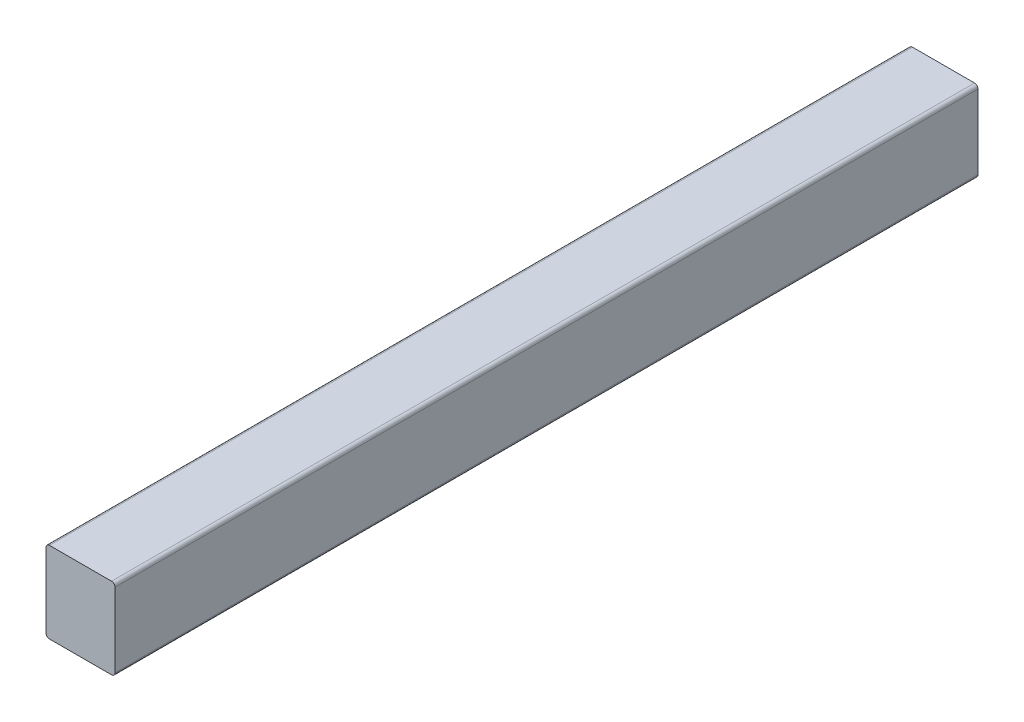
ISO-10303-21;
HEADER;
FILE_DESCRIPTION(('STEP AP214'),'2;1');
FILE_NAME('part.step','',(''),(''),'','','');
FILE_SCHEMA(('AUTOMOTIVE_DESIGN { 1 0 10303 214 1 1 1 1 }'));
ENDSEC;
DATA;
#1=APPLICATION_CONTEXT('core data for automotive mechanical design processes');
#2=APPLICATION_PROTOCOL_DEFINITION('international standard','automotive_design',2000,#1);
#3=PRODUCT_CONTEXT('',#1,'mechanical');
#4=PRODUCT('Part','Part','',(#3));
#5=PRODUCT_RELATED_PRODUCT_CATEGORY('part','',(#4));
#6=PRODUCT_DEFINITION_FORMATION('','',#4);
#7=PRODUCT_DEFINITION_CONTEXT('part definition',#1,'design');
#8=PRODUCT_DEFINITION('design','',#6,#7);
#9=PRODUCT_DEFINITION_SHAPE('','',#8);
#10=(LENGTH_UNIT() NAMED_UNIT(*) SI_UNIT(.MILLI.,.METRE.));
#11=(NAMED_UNIT(*) PLANE_ANGLE_UNIT() SI_UNIT($,.RADIAN.));
#12=(NAMED_UNIT(*) SI_UNIT($,.STERADIAN.) SOLID_ANGLE_UNIT());
#13=UNCERTAINTY_MEASURE_WITH_UNIT(LENGTH_MEASURE(1.E-05),#10,'distance_accuracy_value','');
#14=(GEOMETRIC_REPRESENTATION_CONTEXT(3) GLOBAL_UNCERTAINTY_ASSIGNED_CONTEXT((#13)) GLOBAL_UNIT_ASSIGNED_CONTEXT((#10,
#11,#12)) REPRESENTATION_CONTEXT('',''));
#15=CARTESIAN_POINT('',(0.,0.,0.));
#16=DIRECTION('',(0.,0.,1.));
#17=DIRECTION('',(1.,0.,0.));
#18=AXIS2_PLACEMENT_3D('',#15,#16,#17);
#19=CARTESIAN_POINT('',(-2.,2.35,50.));
#20=DIRECTION('',(1.,0.,0.));
#21=DIRECTION('',(0.,1.,0.));
#22=AXIS2_PLACEMENT_3D('',#19,#20,#21);
#23=PLANE('',#22);
#24=DIRECTION('',(0.,-1.,0.));
#25=VECTOR('',#24,1.);
#26=CARTESIAN_POINT('',(-2.,2.35,0.));
#27=LINE('',#26,#25);
#28=CARTESIAN_POINT('',(-2.,2.15,0.));
#29=VERTEX_POINT('',#28);
#30=CARTESIAN_POINT('',(-2.,-2.15,0.));
#31=VERTEX_POINT('',#30);
#32=EDGE_CURVE('E127',#29,#31,#27,.T.);
#33=ORIENTED_EDGE('',*,*,#32,.T.);
#34=DIRECTION('',(0.,0.,-1.));
#35=VECTOR('',#34,1.);
#36=CARTESIAN_POINT('',(-2.,-2.15,50.));
#37=LINE('',#36,#35);
#38=CARTESIAN_POINT('',(-2.,-2.15,50.));
#39=VERTEX_POINT('',#38);
#40=EDGE_CURVE('E105',#31,#39,#37,.F.);
#41=ORIENTED_EDGE('',*,*,#40,.T.);
#42=DIRECTION('',(0.,-1.,0.));
#43=VECTOR('',#42,1.);
#44=CARTESIAN_POINT('',(-2.,2.35,50.));
#45=LINE('',#44,#43);
#46=CARTESIAN_POINT('',(-2.,2.15,50.));
#47=VERTEX_POINT('',#46);
#48=EDGE_CURVE('E136',#47,#39,#45,.T.);
#49=ORIENTED_EDGE('',*,*,#48,.F.);
#50=DIRECTION('',(0.,0.,-1.));
#51=VECTOR('',#50,1.);
#52=CARTESIAN_POINT('',(-2.,2.15,50.));
#53=LINE('',#52,#51);
#54=EDGE_CURVE('E110',#47,#29,#53,.T.);
#55=ORIENTED_EDGE('',*,*,#54,.T.);
#56=EDGE_LOOP('',(#33,#41,#49,#55));
#57=FACE_BOUND('',#56,.T.);
#58=ADVANCED_FACE('F35',(#57),#23,.F.);
#59=CARTESIAN_POINT('',(2.,-2.35,50.));
#60=DIRECTION('',(0.,1.,0.));
#61=DIRECTION('',(-1.,0.,0.));
#62=AXIS2_PLACEMENT_3D('',#59,#60,#61);
#63=PLANE('',#62);
#64=DIRECTION('',(1.,0.,0.));
#65=VECTOR('',#64,1.);
#66=CARTESIAN_POINT('',(2.,-2.35,50.));
#67=LINE('',#66,#65);
#68=CARTESIAN_POINT('',(-1.8,-2.35,50.));
#69=VERTEX_POINT('',#68);
#70=CARTESIAN_POINT('',(1.8,-2.35,50.));
#71=VERTEX_POINT('',#70);
#72=EDGE_CURVE('E120',#69,#71,#67,.T.);
#73=ORIENTED_EDGE('',*,*,#72,.F.);
#74=DIRECTION('',(0.,0.,-1.));
#75=VECTOR('',#74,1.);
#76=CARTESIAN_POINT('',(-1.8,-2.35,50.));
#77=LINE('',#76,#75);
#78=CARTESIAN_POINT('',(-1.8,-2.35,0.));
#79=VERTEX_POINT('',#78);
#80=EDGE_CURVE('E104',#69,#79,#77,.T.);
#81=ORIENTED_EDGE('',*,*,#80,.T.);
#82=DIRECTION('',(1.,0.,0.));
#83=VECTOR('',#82,1.);
#84=CARTESIAN_POINT('',(2.,-2.35,0.));
#85=LINE('',#84,#83);
#86=CARTESIAN_POINT('',(1.8,-2.35,0.));
#87=VERTEX_POINT('',#86);
#88=EDGE_CURVE('E117',#79,#87,#85,.T.);
#89=ORIENTED_EDGE('',*,*,#88,.T.);
#90=DIRECTION('',(0.,0.,-1.));
#91=VECTOR('',#90,1.);
#92=CARTESIAN_POINT('',(1.8,-2.35,50.));
#93=LINE('',#92,#91);
#94=EDGE_CURVE('E122',#87,#71,#93,.F.);
#95=ORIENTED_EDGE('',*,*,#94,.T.);
#96=EDGE_LOOP('',(#73,#81,#89,#95));
#97=FACE_BOUND('',#96,.T.);
#98=ADVANCED_FACE('F116',(#97),#63,.F.);
#99=CARTESIAN_POINT('',(2.,2.35,50.));
#100=DIRECTION('',(-1.,0.,0.));
#101=DIRECTION('',(0.,-1.,0.));
#102=AXIS2_PLACEMENT_3D('',#99,#100,#101);
#103=PLANE('',#102);
#104=DIRECTION('',(0.,1.,0.));
#105=VECTOR('',#104,1.);
#106=CARTESIAN_POINT('',(2.,2.35,50.));
#107=LINE('',#106,#105);
#108=CARTESIAN_POINT('',(2.,-2.15,50.));
#109=VERTEX_POINT('',#108);
#110=CARTESIAN_POINT('',(2.,2.15,50.));
#111=VERTEX_POINT('',#110);
#112=EDGE_CURVE('E170',#109,#111,#107,.T.);
#113=ORIENTED_EDGE('',*,*,#112,.F.);
#114=DIRECTION('',(0.,0.,-1.));
#115=VECTOR('',#114,1.);
#116=CARTESIAN_POINT('',(2.,-2.15,50.));
#117=LINE('',#116,#115);
#118=CARTESIAN_POINT('',(2.,-2.15,0.));
#119=VERTEX_POINT('',#118);
#120=EDGE_CURVE('E155',#109,#119,#117,.T.);
#121=ORIENTED_EDGE('',*,*,#120,.T.);
#122=DIRECTION('',(0.,1.,0.));
#123=VECTOR('',#122,1.);
#124=CARTESIAN_POINT('',(2.,2.35,0.));
#125=LINE('',#124,#123);
#126=CARTESIAN_POINT('',(2.,2.15,0.));
#127=VERTEX_POINT('',#126);
#128=EDGE_CURVE('E126',#119,#127,#125,.T.);
#129=ORIENTED_EDGE('',*,*,#128,.T.);
#130=DIRECTION('',(0.,0.,-1.));
#131=VECTOR('',#130,1.);
#132=CARTESIAN_POINT('',(2.,2.15,50.));
#133=LINE('',#132,#131);
#134=EDGE_CURVE('E153',#127,#111,#133,.F.);
#135=ORIENTED_EDGE('',*,*,#134,.T.);
#136=EDGE_LOOP('',(#113,#121,#129,#135));
#137=FACE_BOUND('',#136,.T.);
#138=ADVANCED_FACE('F181',(#137),#103,.F.);
#139=CARTESIAN_POINT('',(2.,2.35,50.));
#140=DIRECTION('',(0.,-1.,0.));
#141=DIRECTION('',(1.,0.,0.));
#142=AXIS2_PLACEMENT_3D('',#139,#140,#141);
#143=PLANE('',#142);
#144=DIRECTION('',(-1.,0.,0.));
#145=VECTOR('',#144,1.);
#146=CARTESIAN_POINT('',(2.,2.35,0.));
#147=LINE('',#146,#145);
#148=CARTESIAN_POINT('',(1.8,2.35,0.));
#149=VERTEX_POINT('',#148);
#150=CARTESIAN_POINT('',(-1.8,2.35,0.));
#151=VERTEX_POINT('',#150);
#152=EDGE_CURVE('E130',#149,#151,#147,.T.);
#153=ORIENTED_EDGE('',*,*,#152,.T.);
#154=DIRECTION('',(0.,0.,-1.));
#155=VECTOR('',#154,1.);
#156=CARTESIAN_POINT('',(-1.8,2.35,50.));
#157=LINE('',#156,#155);
#158=CARTESIAN_POINT('',(-1.8,2.35,50.));
#159=VERTEX_POINT('',#158);
#160=EDGE_CURVE('E11',#151,#159,#157,.F.);
#161=ORIENTED_EDGE('',*,*,#160,.T.);
#162=DIRECTION('',(-1.,0.,0.));
#163=VECTOR('',#162,1.);
#164=CARTESIAN_POINT('',(2.,2.35,50.));
#165=LINE('',#164,#163);
#166=CARTESIAN_POINT('',(1.8,2.35,50.));
#167=VERTEX_POINT('',#166);
#168=EDGE_CURVE('E137',#167,#159,#165,.T.);
#169=ORIENTED_EDGE('',*,*,#168,.F.);
#170=DIRECTION('',(0.,0.,-1.));
#171=VECTOR('',#170,1.);
#172=CARTESIAN_POINT('',(1.8,2.35,50.));
#173=LINE('',#172,#171);
#174=EDGE_CURVE('E43',#167,#149,#173,.T.);
#175=ORIENTED_EDGE('',*,*,#174,.T.);
#176=EDGE_LOOP('',(#153,#161,#169,#175));
#177=FACE_BOUND('',#176,.T.);
#178=ADVANCED_FACE('F160',(#177),#143,.F.);
#179=CARTESIAN_POINT('',(0.,0.,50.));
#180=DIRECTION('',(0.,0.,-1.));
#181=DIRECTION('',(-1.,0.,0.));
#182=AXIS2_PLACEMENT_3D('',#179,#180,#181);
#183=PLANE('',#182);
#184=ORIENTED_EDGE('',*,*,#48,.T.);
#185=CARTESIAN_POINT('',(-1.8,-2.15,50.));
#186=DIRECTION('',(0.,0.,-1.));
#187=DIRECTION('',(-1.,0.,0.));
#188=AXIS2_PLACEMENT_3D('',#185,#186,#187);
#189=CIRCLE('',#188,0.2);
#190=EDGE_CURVE('E151',#39,#69,#189,.F.);
#191=ORIENTED_EDGE('',*,*,#190,.T.);
#192=ORIENTED_EDGE('',*,*,#72,.T.);
#193=CARTESIAN_POINT('',(1.8,-2.15,50.));
#194=DIRECTION('',(0.,0.,-1.));
#195=DIRECTION('',(-1.,0.,0.));
#196=AXIS2_PLACEMENT_3D('',#193,#194,#195);
#197=CIRCLE('',#196,0.2);
#198=EDGE_CURVE('E149',#71,#109,#197,.F.);
#199=ORIENTED_EDGE('',*,*,#198,.T.);
#200=ORIENTED_EDGE('',*,*,#112,.T.);
#201=CARTESIAN_POINT('',(1.8,2.15,50.));
#202=DIRECTION('',(0.,0.,-1.));
#203=DIRECTION('',(-1.,0.,0.));
#204=AXIS2_PLACEMENT_3D('',#201,#202,#203);
#205=CIRCLE('',#204,0.2);
#206=EDGE_CURVE('E55',#111,#167,#205,.F.);
#207=ORIENTED_EDGE('',*,*,#206,.T.);
#208=ORIENTED_EDGE('',*,*,#168,.T.);
#209=CARTESIAN_POINT('',(-1.8,2.15,50.));
#210=DIRECTION('',(0.,0.,-1.));
#211=DIRECTION('',(-1.,0.,0.));
#212=AXIS2_PLACEMENT_3D('',#209,#210,#211);
#213=CIRCLE('',#212,0.2);
#214=EDGE_CURVE('E147',#159,#47,#213,.F.);
#215=ORIENTED_EDGE('',*,*,#214,.T.);
#216=EDGE_LOOP('',(#184,#191,#192,#199,#200,#207,#208,#215));
#217=FACE_BOUND('',#216,.T.);
#218=ADVANCED_FACE('F173',(#217),#183,.F.);
#219=CARTESIAN_POINT('',(0.,0.,0.));
#220=DIRECTION('',(0.,0.,-1.));
#221=DIRECTION('',(-1.,0.,0.));
#222=AXIS2_PLACEMENT_3D('',#219,#220,#221);
#223=PLANE('',#222);
#224=ORIENTED_EDGE('',*,*,#88,.F.);
#225=CARTESIAN_POINT('',(-1.8,-2.15,0.));
#226=DIRECTION('',(0.,0.,-1.));
#227=DIRECTION('',(-1.,0.,0.));
#228=AXIS2_PLACEMENT_3D('',#225,#226,#227);
#229=CIRCLE('',#228,0.2);
#230=EDGE_CURVE('E100',#79,#31,#229,.T.);
#231=ORIENTED_EDGE('',*,*,#230,.T.);
#232=ORIENTED_EDGE('',*,*,#32,.F.);
#233=CARTESIAN_POINT('',(-1.8,2.15,0.));
#234=DIRECTION('',(0.,0.,-1.));
#235=DIRECTION('',(-1.,0.,0.));
#236=AXIS2_PLACEMENT_3D('',#233,#234,#235);
#237=CIRCLE('',#236,0.2);
#238=EDGE_CURVE('E140',#29,#151,#237,.T.);
#239=ORIENTED_EDGE('',*,*,#238,.T.);
#240=ORIENTED_EDGE('',*,*,#152,.F.);
#241=CARTESIAN_POINT('',(1.8,2.15,0.));
#242=DIRECTION('',(0.,0.,-1.));
#243=DIRECTION('',(-1.,0.,0.));
#244=AXIS2_PLACEMENT_3D('',#241,#242,#243);
#245=CIRCLE('',#244,0.2);
#246=EDGE_CURVE('E121',#149,#127,#245,.T.);
#247=ORIENTED_EDGE('',*,*,#246,.T.);
#248=ORIENTED_EDGE('',*,*,#128,.F.);
#249=CARTESIAN_POINT('',(1.8,-2.15,0.));
#250=DIRECTION('',(0.,0.,-1.));
#251=DIRECTION('',(-1.,0.,0.));
#252=AXIS2_PLACEMENT_3D('',#249,#250,#251);
#253=CIRCLE('',#252,0.2);
#254=EDGE_CURVE('E111',#119,#87,#253,.T.);
#255=ORIENTED_EDGE('',*,*,#254,.T.);
#256=EDGE_LOOP('',(#224,#231,#232,#239,#240,#247,#248,#255));
#257=FACE_BOUND('',#256,.T.);
#258=ADVANCED_FACE('F124',(#257),#223,.T.);
#259=CARTESIAN_POINT('',(-1.8,-2.15,50.));
#260=DIRECTION('',(0.,0.,-1.));
#261=DIRECTION('',(-1.,0.,0.));
#262=AXIS2_PLACEMENT_3D('',#259,#260,#261);
#263=CYLINDRICAL_SURFACE('',#262,0.2);
#264=ORIENTED_EDGE('',*,*,#190,.F.);
#265=ORIENTED_EDGE('',*,*,#40,.F.);
#266=ORIENTED_EDGE('',*,*,#230,.F.);
#267=ORIENTED_EDGE('',*,*,#80,.F.);
#268=EDGE_LOOP('',(#264,#265,#266,#267));
#269=FACE_BOUND('',#268,.T.);
#270=ADVANCED_FACE('F103',(#269),#263,.T.);
#271=CARTESIAN_POINT('',(1.8,-2.15,50.));
#272=DIRECTION('',(0.,0.,-1.));
#273=DIRECTION('',(-1.,0.,0.));
#274=AXIS2_PLACEMENT_3D('',#271,#272,#273);
#275=CYLINDRICAL_SURFACE('',#274,0.2);
#276=ORIENTED_EDGE('',*,*,#198,.F.);
#277=ORIENTED_EDGE('',*,*,#94,.F.);
#278=ORIENTED_EDGE('',*,*,#254,.F.);
#279=ORIENTED_EDGE('',*,*,#120,.F.);
#280=EDGE_LOOP('',(#276,#277,#278,#279));
#281=FACE_BOUND('',#280,.T.);
#282=ADVANCED_FACE('F193',(#281),#275,.T.);
#283=CARTESIAN_POINT('',(-1.8,2.15,50.));
#284=DIRECTION('',(0.,0.,-1.));
#285=DIRECTION('',(-1.,0.,0.));
#286=AXIS2_PLACEMENT_3D('',#283,#284,#285);
#287=CYLINDRICAL_SURFACE('',#286,0.2);
#288=ORIENTED_EDGE('',*,*,#214,.F.);
#289=ORIENTED_EDGE('',*,*,#160,.F.);
#290=ORIENTED_EDGE('',*,*,#238,.F.);
#291=ORIENTED_EDGE('',*,*,#54,.F.);
#292=EDGE_LOOP('',(#288,#289,#290,#291));
#293=FACE_BOUND('',#292,.T.);
#294=ADVANCED_FACE('F165',(#293),#287,.T.);
#295=CARTESIAN_POINT('',(1.8,2.15,50.));
#296=DIRECTION('',(0.,0.,-1.));
#297=DIRECTION('',(-1.,0.,0.));
#298=AXIS2_PLACEMENT_3D('',#295,#296,#297);
#299=CYLINDRICAL_SURFACE('',#298,0.2);
#300=ORIENTED_EDGE('',*,*,#206,.F.);
#301=ORIENTED_EDGE('',*,*,#134,.F.);
#302=ORIENTED_EDGE('',*,*,#246,.F.);
#303=ORIENTED_EDGE('',*,*,#174,.F.);
#304=EDGE_LOOP('',(#300,#301,#302,#303));
#305=FACE_BOUND('',#304,.T.);
#306=ADVANCED_FACE('F37',(#305),#299,.T.);
#307=CLOSED_SHELL('',(#58,#98,#138,#178,#218,#258,#270,#282,#294,#306));
#308=MANIFOLD_SOLID_BREP('B2',#307);
#309=ADVANCED_BREP_SHAPE_REPRESENTATION('',(#18,#308),#14);
#310=SHAPE_DEFINITION_REPRESENTATION(#9,#309);
ENDSEC;
END-ISO-10303-21;
